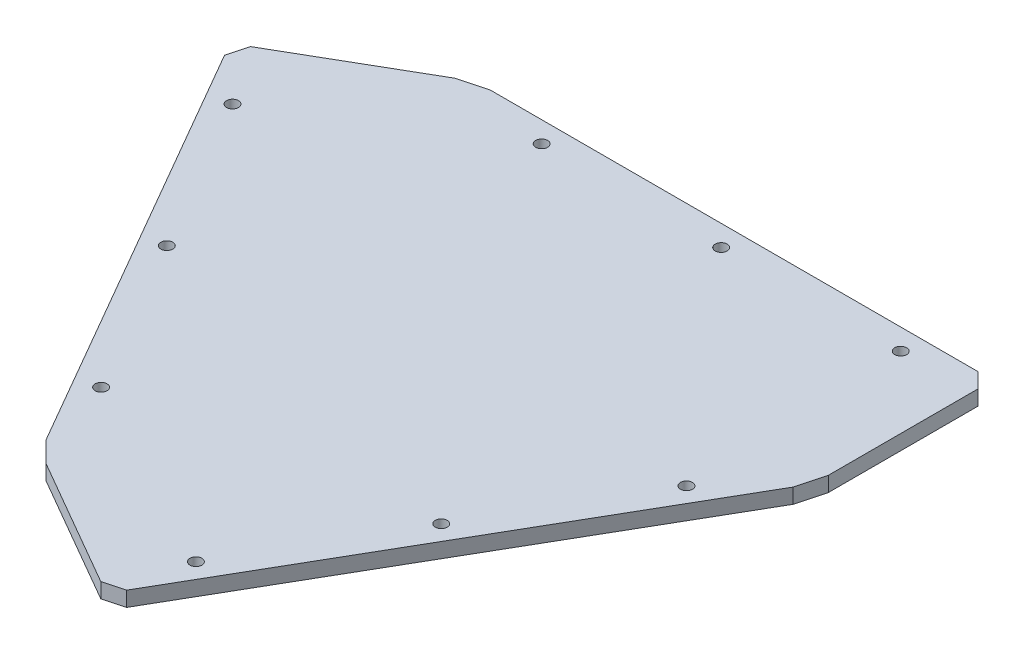
ISO-10303-21;
HEADER;
FILE_DESCRIPTION(('STEP AP214'),'2;1');
FILE_NAME('part.step','',(''),(''),'','','');
FILE_SCHEMA(('AUTOMOTIVE_DESIGN { 1 0 10303 214 1 1 1 1 }'));
ENDSEC;
DATA;
#1=APPLICATION_CONTEXT('core data for automotive mechanical design processes');
#2=APPLICATION_PROTOCOL_DEFINITION('international standard','automotive_design',2000,#1);
#3=PRODUCT_CONTEXT('',#1,'mechanical');
#4=PRODUCT('Part','Part','',(#3));
#5=PRODUCT_RELATED_PRODUCT_CATEGORY('part','',(#4));
#6=PRODUCT_DEFINITION_FORMATION('','',#4);
#7=PRODUCT_DEFINITION_CONTEXT('part definition',#1,'design');
#8=PRODUCT_DEFINITION('design','',#6,#7);
#9=PRODUCT_DEFINITION_SHAPE('','',#8);
#10=(LENGTH_UNIT() NAMED_UNIT(*) SI_UNIT(.MILLI.,.METRE.));
#11=(NAMED_UNIT(*) PLANE_ANGLE_UNIT() SI_UNIT($,.RADIAN.));
#12=(NAMED_UNIT(*) SI_UNIT($,.STERADIAN.) SOLID_ANGLE_UNIT());
#13=UNCERTAINTY_MEASURE_WITH_UNIT(LENGTH_MEASURE(1.E-05),#10,'distance_accuracy_value','');
#14=(GEOMETRIC_REPRESENTATION_CONTEXT(3) GLOBAL_UNCERTAINTY_ASSIGNED_CONTEXT((#13)) GLOBAL_UNIT_ASSIGNED_CONTEXT((#10,
#11,#12)) REPRESENTATION_CONTEXT('',''));
#15=CARTESIAN_POINT('',(0.,0.,0.));
#16=DIRECTION('',(0.,0.,1.));
#17=DIRECTION('',(1.,0.,0.));
#18=AXIS2_PLACEMENT_3D('',#15,#16,#17);
#19=CARTESIAN_POINT('',(12.9903810567668,5.,127.381596569806));
#20=DIRECTION('',(-0.258819045102563,0.,-0.965925826289057));
#21=DIRECTION('',(-0.965925826289057,0.,0.258819045102563));
#22=AXIS2_PLACEMENT_3D('',#19,#20,#21);
#23=PLANE('',#22);
#24=DIRECTION('',(0.965925826289057,0.,-0.258819045102563));
#25=VECTOR('',#24,1.);
#26=CARTESIAN_POINT('',(12.9903810567668,0.,127.381596569806));
#27=LINE('',#26,#25);
#28=CARTESIAN_POINT('',(12.9903810567668,0.,127.381596569806));
#29=VERTEX_POINT('',#28);
#30=CARTESIAN_POINT('',(19.8205080756892,0.,125.551469550883));
#31=VERTEX_POINT('',#30);
#32=EDGE_CURVE('E155',#29,#31,#27,.T.);
#33=ORIENTED_EDGE('',*,*,#32,.T.);
#34=DIRECTION('',(0.,-1.,0.));
#35=VECTOR('',#34,1.);
#36=CARTESIAN_POINT('',(19.8205080756892,5.,125.551469550883));
#37=LINE('',#36,#35);
#38=CARTESIAN_POINT('',(19.8205080756892,5.,125.551469550883));
#39=VERTEX_POINT('',#38);
#40=EDGE_CURVE('E11',#39,#31,#37,.T.);
#41=ORIENTED_EDGE('',*,*,#40,.F.);
#42=DIRECTION('',(0.965925826289057,0.,-0.258819045102563));
#43=VECTOR('',#42,1.);
#44=CARTESIAN_POINT('',(12.9903810567668,5.,127.381596569806));
#45=LINE('',#44,#43);
#46=CARTESIAN_POINT('',(12.9903810567668,5.,127.381596569806));
#47=VERTEX_POINT('',#46);
#48=EDGE_CURVE('E178',#47,#39,#45,.T.);
#49=ORIENTED_EDGE('',*,*,#48,.F.);
#50=DIRECTION('',(0.,-1.,0.));
#51=VECTOR('',#50,1.);
#52=CARTESIAN_POINT('',(12.9903810567668,5.,127.381596569806));
#53=LINE('',#52,#51);
#54=EDGE_CURVE('E151',#47,#29,#53,.T.);
#55=ORIENTED_EDGE('',*,*,#54,.T.);
#56=EDGE_LOOP('',(#33,#41,#49,#55));
#57=FACE_BOUND('',#56,.T.);
#58=ADVANCED_FACE('F35',(#57),#23,.F.);
#59=CARTESIAN_POINT('',(19.8205080756892,5.,125.551469550883));
#60=DIRECTION('',(-0.866025403784438,0.,-0.500000000000001));
#61=DIRECTION('',(-0.500000000000001,0.,0.866025403784438));
#62=AXIS2_PLACEMENT_3D('',#59,#60,#61);
#63=PLANE('',#62);
#64=DIRECTION('',(0.500000000000001,0.,-0.866025403784438));
#65=VECTOR('',#64,1.);
#66=CARTESIAN_POINT('',(19.8205080756892,0.,125.551469550883));
#67=LINE('',#66,#65);
#68=CARTESIAN_POINT('',(101.320508075689,0.,-15.6106712659798));
#69=VERTEX_POINT('',#68);
#70=EDGE_CURVE('E158',#31,#69,#67,.T.);
#71=ORIENTED_EDGE('',*,*,#70,.T.);
#72=DIRECTION('',(0.,-1.,0.));
#73=VECTOR('',#72,1.);
#74=CARTESIAN_POINT('',(101.320508075689,5.,-15.6106712659798));
#75=LINE('',#74,#73);
#76=CARTESIAN_POINT('',(101.320508075689,5.,-15.6106712659798));
#77=VERTEX_POINT('',#76);
#78=EDGE_CURVE('E43',#77,#69,#75,.T.);
#79=ORIENTED_EDGE('',*,*,#78,.F.);
#80=DIRECTION('',(0.500000000000001,0.,-0.866025403784438));
#81=VECTOR('',#80,1.);
#82=CARTESIAN_POINT('',(19.8205080756892,5.,125.551469550883));
#83=LINE('',#82,#81);
#84=EDGE_CURVE('E106',#39,#77,#83,.T.);
#85=ORIENTED_EDGE('',*,*,#84,.F.);
#86=ORIENTED_EDGE('',*,*,#40,.T.);
#87=EDGE_LOOP('',(#71,#79,#85,#86));
#88=FACE_BOUND('',#87,.T.);
#89=ADVANCED_FACE('F257',(#88),#63,.F.);
#90=CARTESIAN_POINT('',(103.820508075689,5.,-24.940798284902));
#91=DIRECTION('',(-0.965925826289067,0.,-0.258819045102527));
#92=DIRECTION('',(-0.258819045102527,0.,0.965925826289067));
#93=AXIS2_PLACEMENT_3D('',#90,#91,#92);
#94=PLANE('',#93);
#95=DIRECTION('',(0.258819045102527,0.,-0.965925826289067));
#96=VECTOR('',#95,1.);
#97=CARTESIAN_POINT('',(103.820508075689,0.,-24.940798284902));
#98=LINE('',#97,#96);
#99=CARTESIAN_POINT('',(103.820508075689,0.,-24.940798284902));
#100=VERTEX_POINT('',#99);
#101=EDGE_CURVE('E161',#69,#100,#98,.T.);
#102=ORIENTED_EDGE('',*,*,#101,.T.);
#103=DIRECTION('',(0.,-1.,0.));
#104=VECTOR('',#103,1.);
#105=CARTESIAN_POINT('',(103.820508075689,5.,-24.940798284902));
#106=LINE('',#105,#104);
#107=CARTESIAN_POINT('',(103.820508075689,5.,-24.940798284902));
#108=VERTEX_POINT('',#107);
#109=EDGE_CURVE('E197',#108,#100,#106,.T.);
#110=ORIENTED_EDGE('',*,*,#109,.F.);
#111=DIRECTION('',(0.258819045102527,0.,-0.965925826289067));
#112=VECTOR('',#111,1.);
#113=CARTESIAN_POINT('',(103.820508075689,5.,-24.940798284902));
#114=LINE('',#113,#112);
#115=EDGE_CURVE('E205',#77,#108,#114,.T.);
#116=ORIENTED_EDGE('',*,*,#115,.F.);
#117=ORIENTED_EDGE('',*,*,#78,.T.);
#118=EDGE_LOOP('',(#102,#110,#116,#117));
#119=FACE_BOUND('',#118,.T.);
#120=ADVANCED_FACE('F203',(#119),#94,.F.);
#121=CARTESIAN_POINT('',(103.820508075689,5.,-74.9407982849015));
#122=DIRECTION('',(-1.,0.,0.));
#123=DIRECTION('',(0.,0.,1.));
#124=AXIS2_PLACEMENT_3D('',#121,#122,#123);
#125=PLANE('',#124);
#126=DIRECTION('',(0.,0.,-1.));
#127=VECTOR('',#126,1.);
#128=CARTESIAN_POINT('',(103.820508075689,0.,-74.9407982849015));
#129=LINE('',#128,#127);
#130=CARTESIAN_POINT('',(103.820508075689,0.,-74.9407982849015));
#131=VERTEX_POINT('',#130);
#132=EDGE_CURVE('E163',#100,#131,#129,.T.);
#133=ORIENTED_EDGE('',*,*,#132,.T.);
#134=DIRECTION('',(0.,-1.,0.));
#135=VECTOR('',#134,1.);
#136=CARTESIAN_POINT('',(103.820508075689,5.,-74.9407982849015));
#137=LINE('',#136,#135);
#138=CARTESIAN_POINT('',(103.820508075689,5.,-74.9407982849015));
#139=VERTEX_POINT('',#138);
#140=EDGE_CURVE('E194',#139,#131,#137,.T.);
#141=ORIENTED_EDGE('',*,*,#140,.F.);
#142=DIRECTION('',(0.,0.,-1.));
#143=VECTOR('',#142,1.);
#144=CARTESIAN_POINT('',(103.820508075689,5.,-74.9407982849015));
#145=LINE('',#144,#143);
#146=EDGE_CURVE('E223',#108,#139,#145,.T.);
#147=ORIENTED_EDGE('',*,*,#146,.F.);
#148=ORIENTED_EDGE('',*,*,#109,.T.);
#149=EDGE_LOOP('',(#133,#141,#147,#148));
#150=FACE_BOUND('',#149,.T.);
#151=ADVANCED_FACE('F214',(#150),#125,.F.);
#152=CARTESIAN_POINT('',(103.820508075689,5.,-74.9407982849015));
#153=DIRECTION('',(-0.70710678118656,0.,0.707106781186535));
#154=DIRECTION('',(0.707106781186535,0.,0.70710678118656));
#155=AXIS2_PLACEMENT_3D('',#152,#153,#154);
#156=PLANE('',#155);
#157=DIRECTION('',(-0.707106781186535,0.,-0.70710678118656));
#158=VECTOR('',#157,1.);
#159=CARTESIAN_POINT('',(103.820508075689,0.,-74.9407982849015));
#160=LINE('',#159,#158);
#161=CARTESIAN_POINT('',(98.8205080756893,0.,-79.9407982849019));
#162=VERTEX_POINT('',#161);
#163=EDGE_CURVE('E165',#131,#162,#160,.T.);
#164=ORIENTED_EDGE('',*,*,#163,.T.);
#165=DIRECTION('',(0.,-1.,0.));
#166=VECTOR('',#165,1.);
#167=CARTESIAN_POINT('',(98.8205080756893,5.,-79.9407982849019));
#168=LINE('',#167,#166);
#169=CARTESIAN_POINT('',(98.8205080756893,5.,-79.9407982849019));
#170=VERTEX_POINT('',#169);
#171=EDGE_CURVE('E191',#170,#162,#168,.T.);
#172=ORIENTED_EDGE('',*,*,#171,.F.);
#173=DIRECTION('',(-0.707106781186535,0.,-0.70710678118656));
#174=VECTOR('',#173,1.);
#175=CARTESIAN_POINT('',(103.820508075689,5.,-74.9407982849015));
#176=LINE('',#175,#174);
#177=EDGE_CURVE('E220',#139,#170,#176,.T.);
#178=ORIENTED_EDGE('',*,*,#177,.F.);
#179=ORIENTED_EDGE('',*,*,#140,.T.);
#180=EDGE_LOOP('',(#164,#172,#178,#179));
#181=FACE_BOUND('',#180,.T.);
#182=ADVANCED_FACE('F218',(#181),#156,.F.);
#183=CARTESIAN_POINT('',(-64.1794919243112,5.,-79.940798284903));
#184=DIRECTION('',(0.,0.,1.));
#185=DIRECTION('',(1.,0.,0.));
#186=AXIS2_PLACEMENT_3D('',#183,#184,#185);
#187=PLANE('',#186);
#188=DIRECTION('',(-1.,0.,0.));
#189=VECTOR('',#188,1.);
#190=CARTESIAN_POINT('',(-64.1794919243112,0.,-79.940798284903));
#191=LINE('',#190,#189);
#192=CARTESIAN_POINT('',(-64.1794919243112,0.,-79.940798284903));
#193=VERTEX_POINT('',#192);
#194=EDGE_CURVE('E167',#162,#193,#191,.T.);
#195=ORIENTED_EDGE('',*,*,#194,.T.);
#196=DIRECTION('',(0.,-1.,0.));
#197=VECTOR('',#196,1.);
#198=CARTESIAN_POINT('',(-64.1794919243112,5.,-79.940798284903));
#199=LINE('',#198,#197);
#200=CARTESIAN_POINT('',(-64.1794919243112,5.,-79.940798284903));
#201=VERTEX_POINT('',#200);
#202=EDGE_CURVE('E188',#201,#193,#199,.T.);
#203=ORIENTED_EDGE('',*,*,#202,.F.);
#204=DIRECTION('',(-1.,0.,0.));
#205=VECTOR('',#204,1.);
#206=CARTESIAN_POINT('',(-64.1794919243112,5.,-79.940798284903));
#207=LINE('',#206,#205);
#208=EDGE_CURVE('E222',#170,#201,#207,.T.);
#209=ORIENTED_EDGE('',*,*,#208,.F.);
#210=ORIENTED_EDGE('',*,*,#171,.T.);
#211=EDGE_LOOP('',(#195,#203,#209,#210));
#212=FACE_BOUND('',#211,.T.);
#213=ADVANCED_FACE('F270',(#212),#187,.F.);
#214=CARTESIAN_POINT('',(-73.5096189432334,5.,-77.440798284903));
#215=DIRECTION('',(0.258819045102516,0.,0.96592582628907));
#216=DIRECTION('',(0.96592582628907,0.,-0.258819045102516));
#217=AXIS2_PLACEMENT_3D('',#214,#215,#216);
#218=PLANE('',#217);
#219=DIRECTION('',(-0.96592582628907,0.,0.258819045102516));
#220=VECTOR('',#219,1.);
#221=CARTESIAN_POINT('',(-73.5096189432334,0.,-77.440798284903));
#222=LINE('',#221,#220);
#223=CARTESIAN_POINT('',(-73.5096189432334,0.,-77.440798284903));
#224=VERTEX_POINT('',#223);
#225=EDGE_CURVE('E169',#193,#224,#222,.T.);
#226=ORIENTED_EDGE('',*,*,#225,.T.);
#227=DIRECTION('',(0.,-1.,0.));
#228=VECTOR('',#227,1.);
#229=CARTESIAN_POINT('',(-73.5096189432334,5.,-77.440798284903));
#230=LINE('',#229,#228);
#231=CARTESIAN_POINT('',(-73.5096189432334,5.,-77.440798284903));
#232=VERTEX_POINT('',#231);
#233=EDGE_CURVE('E185',#232,#224,#230,.T.);
#234=ORIENTED_EDGE('',*,*,#233,.F.);
#235=DIRECTION('',(-0.96592582628907,0.,0.258819045102516));
#236=VECTOR('',#235,1.);
#237=CARTESIAN_POINT('',(-73.5096189432334,5.,-77.440798284903));
#238=LINE('',#237,#236);
#239=EDGE_CURVE('E225',#201,#232,#238,.T.);
#240=ORIENTED_EDGE('',*,*,#239,.F.);
#241=ORIENTED_EDGE('',*,*,#202,.T.);
#242=EDGE_LOOP('',(#226,#234,#240,#241));
#243=FACE_BOUND('',#242,.T.);
#244=ADVANCED_FACE('F273',(#243),#218,.F.);
#245=CARTESIAN_POINT('',(-73.5096189432334,5.,-77.440798284903));
#246=DIRECTION('',(0.499999999999999,0.,0.866025403784439));
#247=DIRECTION('',(0.866025403784439,0.,-0.499999999999999));
#248=AXIS2_PLACEMENT_3D('',#245,#246,#247);
#249=PLANE('',#248);
#250=DIRECTION('',(-0.866025403784439,0.,0.499999999999999));
#251=VECTOR('',#250,1.);
#252=CARTESIAN_POINT('',(-73.5096189432334,0.,-77.440798284903));
#253=LINE('',#252,#251);
#254=CARTESIAN_POINT('',(-116.810889132455,0.,-52.4407982849032));
#255=VERTEX_POINT('',#254);
#256=EDGE_CURVE('E171',#224,#255,#253,.T.);
#257=ORIENTED_EDGE('',*,*,#256,.T.);
#258=DIRECTION('',(0.,-1.,0.));
#259=VECTOR('',#258,1.);
#260=CARTESIAN_POINT('',(-116.810889132455,5.,-52.4407982849032));
#261=LINE('',#260,#259);
#262=CARTESIAN_POINT('',(-116.810889132455,5.,-52.4407982849032));
#263=VERTEX_POINT('',#262);
#264=EDGE_CURVE('E182',#263,#255,#261,.T.);
#265=ORIENTED_EDGE('',*,*,#264,.F.);
#266=DIRECTION('',(-0.866025403784439,0.,0.499999999999999));
#267=VECTOR('',#266,1.);
#268=CARTESIAN_POINT('',(-73.5096189432334,5.,-77.440798284903));
#269=LINE('',#268,#267);
#270=EDGE_CURVE('E231',#232,#263,#269,.T.);
#271=ORIENTED_EDGE('',*,*,#270,.F.);
#272=ORIENTED_EDGE('',*,*,#233,.T.);
#273=EDGE_LOOP('',(#257,#265,#271,#272));
#274=FACE_BOUND('',#273,.T.);
#275=ADVANCED_FACE('F237',(#274),#249,.F.);
#276=CARTESIAN_POINT('',(-116.810889132455,5.,-52.4407982849032));
#277=DIRECTION('',(0.965925826289074,0.,0.258819045102499));
#278=DIRECTION('',(0.258819045102499,0.,-0.965925826289074));
#279=AXIS2_PLACEMENT_3D('',#276,#277,#278);
#280=PLANE('',#279);
#281=DIRECTION('',(-0.258819045102499,0.,0.965925826289074));
#282=VECTOR('',#281,1.);
#283=CARTESIAN_POINT('',(-116.810889132455,0.,-52.4407982849032));
#284=LINE('',#283,#282);
#285=CARTESIAN_POINT('',(-118.641016151377,0.,-45.6106712659807));
#286=VERTEX_POINT('',#285);
#287=EDGE_CURVE('E173',#255,#286,#284,.T.);
#288=ORIENTED_EDGE('',*,*,#287,.T.);
#289=DIRECTION('',(0.,-1.,0.));
#290=VECTOR('',#289,1.);
#291=CARTESIAN_POINT('',(-118.641016151377,5.,-45.6106712659807));
#292=LINE('',#291,#290);
#293=CARTESIAN_POINT('',(-118.641016151377,5.,-45.6106712659807));
#294=VERTEX_POINT('',#293);
#295=EDGE_CURVE('E146',#294,#286,#292,.T.);
#296=ORIENTED_EDGE('',*,*,#295,.F.);
#297=DIRECTION('',(-0.258819045102499,0.,0.965925826289074));
#298=VECTOR('',#297,1.);
#299=CARTESIAN_POINT('',(-116.810889132455,5.,-52.4407982849032));
#300=LINE('',#299,#298);
#301=EDGE_CURVE('E137',#263,#294,#300,.T.);
#302=ORIENTED_EDGE('',*,*,#301,.F.);
#303=ORIENTED_EDGE('',*,*,#264,.T.);
#304=EDGE_LOOP('',(#288,#296,#302,#303));
#305=FACE_BOUND('',#304,.T.);
#306=ADVANCED_FACE('F241',(#305),#280,.F.);
#307=CARTESIAN_POINT('',(-118.641016151377,5.,-45.6106712659807));
#308=DIRECTION('',(0.86602540378444,0.,-0.499999999999998));
#309=DIRECTION('',(-0.499999999999998,0.,-0.86602540378444));
#310=AXIS2_PLACEMENT_3D('',#307,#308,#309);
#311=PLANE('',#310);
#312=DIRECTION('',(0.499999999999998,0.,0.86602540378444));
#313=VECTOR('',#312,1.);
#314=CARTESIAN_POINT('',(-118.641016151377,0.,-45.6106712659807));
#315=LINE('',#314,#313);
#316=CARTESIAN_POINT('',(-37.1410161513774,0.,95.5514695508834));
#317=VERTEX_POINT('',#316);
#318=EDGE_CURVE('E145',#286,#317,#315,.T.);
#319=ORIENTED_EDGE('',*,*,#318,.T.);
#320=DIRECTION('',(0.,-1.,0.));
#321=VECTOR('',#320,1.);
#322=CARTESIAN_POINT('',(-37.1410161513774,5.,95.5514695508834));
#323=LINE('',#322,#321);
#324=CARTESIAN_POINT('',(-37.1410161513774,5.,95.5514695508834));
#325=VERTEX_POINT('',#324);
#326=EDGE_CURVE('E142',#325,#317,#323,.T.);
#327=ORIENTED_EDGE('',*,*,#326,.F.);
#328=DIRECTION('',(0.499999999999998,0.,0.86602540378444));
#329=VECTOR('',#328,1.);
#330=CARTESIAN_POINT('',(-118.641016151377,5.,-45.6106712659807));
#331=LINE('',#330,#329);
#332=EDGE_CURVE('E131',#294,#325,#331,.T.);
#333=ORIENTED_EDGE('',*,*,#332,.F.);
#334=ORIENTED_EDGE('',*,*,#295,.T.);
#335=EDGE_LOOP('',(#319,#327,#333,#334));
#336=FACE_BOUND('',#335,.T.);
#337=ADVANCED_FACE('F143',(#336),#311,.F.);
#338=CARTESIAN_POINT('',(-30.3108891324552,5.,102.381596569806));
#339=DIRECTION('',(0.707106781186546,0.,-0.707106781186549));
#340=DIRECTION('',(-0.707106781186549,0.,-0.707106781186546));
#341=AXIS2_PLACEMENT_3D('',#338,#339,#340);
#342=PLANE('',#341);
#343=DIRECTION('',(0.707106781186549,0.,0.707106781186546));
#344=VECTOR('',#343,1.);
#345=CARTESIAN_POINT('',(-30.3108891324552,0.,102.381596569806));
#346=LINE('',#345,#344);
#347=CARTESIAN_POINT('',(-30.3108891324552,0.,102.381596569806));
#348=VERTEX_POINT('',#347);
#349=EDGE_CURVE('E92',#317,#348,#346,.T.);
#350=ORIENTED_EDGE('',*,*,#349,.T.);
#351=DIRECTION('',(0.,-1.,0.));
#352=VECTOR('',#351,1.);
#353=CARTESIAN_POINT('',(-30.3108891324552,5.,102.381596569806));
#354=LINE('',#353,#352);
#355=CARTESIAN_POINT('',(-30.3108891324552,5.,102.381596569806));
#356=VERTEX_POINT('',#355);
#357=EDGE_CURVE('E147',#356,#348,#354,.T.);
#358=ORIENTED_EDGE('',*,*,#357,.F.);
#359=DIRECTION('',(0.707106781186549,0.,0.707106781186546));
#360=VECTOR('',#359,1.);
#361=CARTESIAN_POINT('',(-30.3108891324552,5.,102.381596569806));
#362=LINE('',#361,#360);
#363=EDGE_CURVE('E135',#325,#356,#362,.T.);
#364=ORIENTED_EDGE('',*,*,#363,.F.);
#365=ORIENTED_EDGE('',*,*,#326,.T.);
#366=EDGE_LOOP('',(#350,#358,#364,#365));
#367=FACE_BOUND('',#366,.T.);
#368=ADVANCED_FACE('F149',(#367),#342,.F.);
#369=CARTESIAN_POINT('',(12.9903810567668,5.,127.381596569806));
#370=DIRECTION('',(0.500000000000001,0.,-0.866025403784438));
#371=DIRECTION('',(-0.866025403784438,0.,-0.500000000000001));
#372=AXIS2_PLACEMENT_3D('',#369,#370,#371);
#373=PLANE('',#372);
#374=DIRECTION('',(0.866025403784438,0.,0.500000000000001));
#375=VECTOR('',#374,1.);
#376=CARTESIAN_POINT('',(12.9903810567668,0.,127.381596569806));
#377=LINE('',#376,#375);
#378=EDGE_CURVE('E98',#348,#29,#377,.T.);
#379=ORIENTED_EDGE('',*,*,#378,.T.);
#380=ORIENTED_EDGE('',*,*,#54,.F.);
#381=DIRECTION('',(0.866025403784438,0.,0.500000000000001));
#382=VECTOR('',#381,1.);
#383=CARTESIAN_POINT('',(12.9903810567668,5.,127.381596569806));
#384=LINE('',#383,#382);
#385=EDGE_CURVE('E51',#356,#47,#384,.T.);
#386=ORIENTED_EDGE('',*,*,#385,.F.);
#387=ORIENTED_EDGE('',*,*,#357,.T.);
#388=EDGE_LOOP('',(#379,#380,#386,#387));
#389=FACE_BOUND('',#388,.T.);
#390=ADVANCED_FACE('F245',(#389),#373,.F.);
#391=CARTESIAN_POINT('',(103.820508075688,5.,103.043737386665));
#392=DIRECTION('',(0.,-1.,0.));
#393=DIRECTION('',(0.,0.,-1.));
#394=AXIS2_PLACEMENT_3D('',#391,#392,#393);
#395=PLANE('',#394);
#396=CARTESIAN_POINT('',(83.1685842870418,5.,1.82938299107432));
#397=DIRECTION('',(0.,1.,0.));
#398=DIRECTION('',(0.,0.,1.));
#399=AXIS2_PLACEMENT_3D('',#396,#397,#398);
#400=CIRCLE('',#399,2.00000000000001);
#401=CARTESIAN_POINT('',(83.1685842870418,5.,3.82938299107432));
#402=VERTEX_POINT('',#401);
#403=EDGE_CURVE('E409',#402,#402,#400,.T.);
#404=ORIENTED_EDGE('',*,*,#403,.F.);
#405=EDGE_LOOP('',(#404));
#406=FACE_BOUND('',#405,.T.);
#407=CARTESIAN_POINT('',(53.1685842870413,5.,53.7909072181404));
#408=DIRECTION('',(0.,1.,0.));
#409=DIRECTION('',(0.,0.,1.));
#410=AXIS2_PLACEMENT_3D('',#407,#408,#409);
#411=CIRCLE('',#410,2.);
#412=CARTESIAN_POINT('',(53.1685842870413,5.,55.7909072181404));
#413=VERTEX_POINT('',#412);
#414=EDGE_CURVE('E413',#413,#413,#411,.T.);
#415=ORIENTED_EDGE('',*,*,#414,.F.);
#416=EDGE_LOOP('',(#415));
#417=FACE_BOUND('',#416,.T.);
#418=CARTESIAN_POINT('',(23.1685842870409,5.,105.752431445206));
#419=DIRECTION('',(0.,1.,0.));
#420=DIRECTION('',(0.,0.,1.));
#421=AXIS2_PLACEMENT_3D('',#418,#419,#420);
#422=CIRCLE('',#421,1.99999999999999);
#423=CARTESIAN_POINT('',(23.1685842870409,5.,107.752431445206));
#424=VERTEX_POINT('',#423);
#425=EDGE_CURVE('E420',#424,#424,#422,.T.);
#426=ORIENTED_EDGE('',*,*,#425,.F.);
#427=EDGE_LOOP('',(#426));
#428=FACE_BOUND('',#427,.T.);
#429=CARTESIAN_POINT('',(-39.9999999999997,5.,-72.9407982849025));
#430=DIRECTION('',(0.,1.,0.));
#431=DIRECTION('',(0.,0.,1.));
#432=AXIS2_PLACEMENT_3D('',#429,#430,#431);
#433=CIRCLE('',#432,2.);
#434=CARTESIAN_POINT('',(-39.9999999999997,5.,-70.9407982849025));
#435=VERTEX_POINT('',#434);
#436=EDGE_CURVE('E426',#435,#435,#433,.T.);
#437=ORIENTED_EDGE('',*,*,#436,.F.);
#438=EDGE_LOOP('',(#437));
#439=FACE_BOUND('',#438,.T.);
#440=CARTESIAN_POINT('',(20.0000000000003,5.,-72.9407982849022));
#441=DIRECTION('',(0.,1.,0.));
#442=DIRECTION('',(0.,0.,1.));
#443=AXIS2_PLACEMENT_3D('',#440,#441,#442);
#444=CIRCLE('',#443,2.);
#445=CARTESIAN_POINT('',(20.0000000000003,5.,-70.9407982849022));
#446=VERTEX_POINT('',#445);
#447=EDGE_CURVE('E432',#446,#446,#444,.T.);
#448=ORIENTED_EDGE('',*,*,#447,.F.);
#449=EDGE_LOOP('',(#448));
#450=FACE_BOUND('',#449,.T.);
#451=CARTESIAN_POINT('',(80.0000000000003,5.,-72.940798284902));
#452=DIRECTION('',(0.,1.,0.));
#453=DIRECTION('',(0.,0.,1.));
#454=AXIS2_PLACEMENT_3D('',#451,#452,#453);
#455=CIRCLE('',#454,2.);
#456=CARTESIAN_POINT('',(80.0000000000003,5.,-70.940798284902));
#457=VERTEX_POINT('',#456);
#458=EDGE_CURVE('E438',#457,#457,#455,.T.);
#459=ORIENTED_EDGE('',*,*,#458,.F.);
#460=EDGE_LOOP('',(#459));
#461=FACE_BOUND('',#460,.T.);
#462=CARTESIAN_POINT('',(-43.1685842870418,5.,71.1114152938288));
#463=DIRECTION('',(0.,1.,0.));
#464=DIRECTION('',(0.,0.,1.));
#465=AXIS2_PLACEMENT_3D('',#462,#463,#464);
#466=CIRCLE('',#465,2.);
#467=CARTESIAN_POINT('',(-43.1685842870418,5.,73.1114152938288));
#468=VERTEX_POINT('',#467);
#469=EDGE_CURVE('E444',#468,#468,#466,.T.);
#470=ORIENTED_EDGE('',*,*,#469,.F.);
#471=EDGE_LOOP('',(#470));
#472=FACE_BOUND('',#471,.T.);
#473=CARTESIAN_POINT('',(-73.1685842870418,5.,19.1498910667624));
#474=DIRECTION('',(0.,1.,0.));
#475=DIRECTION('',(0.,0.,1.));
#476=AXIS2_PLACEMENT_3D('',#473,#474,#475);
#477=CIRCLE('',#476,2.);
#478=CARTESIAN_POINT('',(-73.1685842870418,5.,21.1498910667624));
#479=VERTEX_POINT('',#478);
#480=EDGE_CURVE('E450',#479,#479,#477,.T.);
#481=ORIENTED_EDGE('',*,*,#480,.F.);
#482=EDGE_LOOP('',(#481));
#483=FACE_BOUND('',#482,.T.);
#484=CARTESIAN_POINT('',(-103.168584287042,5.,-32.8116331603039));
#485=DIRECTION('',(0.,1.,0.));
#486=DIRECTION('',(0.,0.,1.));
#487=AXIS2_PLACEMENT_3D('',#484,#485,#486);
#488=CIRCLE('',#487,2.);
#489=CARTESIAN_POINT('',(-103.168584287042,5.,-30.8116331603039));
#490=VERTEX_POINT('',#489);
#491=EDGE_CURVE('E159',#490,#490,#488,.T.);
#492=ORIENTED_EDGE('',*,*,#491,.F.);
#493=EDGE_LOOP('',(#492));
#494=FACE_BOUND('',#493,.T.);
#495=ORIENTED_EDGE('',*,*,#48,.T.);
#496=ORIENTED_EDGE('',*,*,#84,.T.);
#497=ORIENTED_EDGE('',*,*,#115,.T.);
#498=ORIENTED_EDGE('',*,*,#146,.T.);
#499=ORIENTED_EDGE('',*,*,#177,.T.);
#500=ORIENTED_EDGE('',*,*,#208,.T.);
#501=ORIENTED_EDGE('',*,*,#239,.T.);
#502=ORIENTED_EDGE('',*,*,#270,.T.);
#503=ORIENTED_EDGE('',*,*,#301,.T.);
#504=ORIENTED_EDGE('',*,*,#332,.T.);
#505=ORIENTED_EDGE('',*,*,#363,.T.);
#506=ORIENTED_EDGE('',*,*,#385,.T.);
#507=EDGE_LOOP('',(#495,#496,#497,#498,#499,#500,#501,#502,#503,#504,#505,#506));
#508=FACE_BOUND('',#507,.T.);
#509=ADVANCED_FACE('F133',(#406,#417,#428,#439,#450,#461,#472,#483,#494,#508),#395,.F.);
#510=CARTESIAN_POINT('',(103.820508075688,0.,103.043737386665));
#511=DIRECTION('',(0.,-1.,0.));
#512=DIRECTION('',(0.,0.,-1.));
#513=AXIS2_PLACEMENT_3D('',#510,#511,#512);
#514=PLANE('',#513);
#515=CARTESIAN_POINT('',(83.1685842870418,0.,1.82938299107432));
#516=DIRECTION('',(0.,-1.,0.));
#517=DIRECTION('',(0.,0.,-1.));
#518=AXIS2_PLACEMENT_3D('',#515,#516,#517);
#519=CIRCLE('',#518,2.00000000000001);
#520=CARTESIAN_POINT('',(83.1685842870418,0.,-0.170617008925688));
#521=VERTEX_POINT('',#520);
#522=EDGE_CURVE('E406',#521,#521,#519,.F.);
#523=ORIENTED_EDGE('',*,*,#522,.T.);
#524=EDGE_LOOP('',(#523));
#525=FACE_BOUND('',#524,.T.);
#526=CARTESIAN_POINT('',(53.1685842870413,0.,53.7909072181404));
#527=DIRECTION('',(0.,-1.,0.));
#528=DIRECTION('',(0.,0.,-1.));
#529=AXIS2_PLACEMENT_3D('',#526,#527,#528);
#530=CIRCLE('',#529,2.);
#531=CARTESIAN_POINT('',(53.1685842870413,0.,51.7909072181404));
#532=VERTEX_POINT('',#531);
#533=EDGE_CURVE('E410',#532,#532,#530,.F.);
#534=ORIENTED_EDGE('',*,*,#533,.T.);
#535=EDGE_LOOP('',(#534));
#536=FACE_BOUND('',#535,.T.);
#537=CARTESIAN_POINT('',(23.1685842870409,0.,105.752431445206));
#538=DIRECTION('',(0.,-1.,0.));
#539=DIRECTION('',(0.,0.,-1.));
#540=AXIS2_PLACEMENT_3D('',#537,#538,#539);
#541=CIRCLE('',#540,1.99999999999999);
#542=CARTESIAN_POINT('',(23.1685842870409,0.,103.752431445206));
#543=VERTEX_POINT('',#542);
#544=EDGE_CURVE('E418',#543,#543,#541,.F.);
#545=ORIENTED_EDGE('',*,*,#544,.T.);
#546=EDGE_LOOP('',(#545));
#547=FACE_BOUND('',#546,.T.);
#548=CARTESIAN_POINT('',(-39.9999999999997,0.,-72.9407982849025));
#549=DIRECTION('',(0.,-1.,0.));
#550=DIRECTION('',(0.,0.,-1.));
#551=AXIS2_PLACEMENT_3D('',#548,#549,#550);
#552=CIRCLE('',#551,2.);
#553=CARTESIAN_POINT('',(-39.9999999999997,0.,-74.9407982849025));
#554=VERTEX_POINT('',#553);
#555=EDGE_CURVE('E423',#554,#554,#552,.F.);
#556=ORIENTED_EDGE('',*,*,#555,.T.);
#557=EDGE_LOOP('',(#556));
#558=FACE_BOUND('',#557,.T.);
#559=CARTESIAN_POINT('',(20.0000000000003,0.,-72.9407982849022));
#560=DIRECTION('',(0.,-1.,0.));
#561=DIRECTION('',(0.,0.,-1.));
#562=AXIS2_PLACEMENT_3D('',#559,#560,#561);
#563=CIRCLE('',#562,2.);
#564=CARTESIAN_POINT('',(20.0000000000003,0.,-74.9407982849022));
#565=VERTEX_POINT('',#564);
#566=EDGE_CURVE('E429',#565,#565,#563,.F.);
#567=ORIENTED_EDGE('',*,*,#566,.T.);
#568=EDGE_LOOP('',(#567));
#569=FACE_BOUND('',#568,.T.);
#570=CARTESIAN_POINT('',(80.0000000000003,0.,-72.940798284902));
#571=DIRECTION('',(0.,-1.,0.));
#572=DIRECTION('',(0.,0.,-1.));
#573=AXIS2_PLACEMENT_3D('',#570,#571,#572);
#574=CIRCLE('',#573,2.);
#575=CARTESIAN_POINT('',(80.0000000000003,0.,-74.940798284902));
#576=VERTEX_POINT('',#575);
#577=EDGE_CURVE('E435',#576,#576,#574,.F.);
#578=ORIENTED_EDGE('',*,*,#577,.T.);
#579=EDGE_LOOP('',(#578));
#580=FACE_BOUND('',#579,.T.);
#581=CARTESIAN_POINT('',(-43.1685842870418,0.,71.1114152938288));
#582=DIRECTION('',(0.,-1.,0.));
#583=DIRECTION('',(0.,0.,-1.));
#584=AXIS2_PLACEMENT_3D('',#581,#582,#583);
#585=CIRCLE('',#584,2.);
#586=CARTESIAN_POINT('',(-43.1685842870418,0.,69.1114152938287));
#587=VERTEX_POINT('',#586);
#588=EDGE_CURVE('E441',#587,#587,#585,.F.);
#589=ORIENTED_EDGE('',*,*,#588,.T.);
#590=EDGE_LOOP('',(#589));
#591=FACE_BOUND('',#590,.T.);
#592=CARTESIAN_POINT('',(-73.1685842870418,0.,19.1498910667624));
#593=DIRECTION('',(0.,-1.,0.));
#594=DIRECTION('',(0.,0.,-1.));
#595=AXIS2_PLACEMENT_3D('',#592,#593,#594);
#596=CIRCLE('',#595,2.);
#597=CARTESIAN_POINT('',(-73.1685842870418,0.,17.1498910667624));
#598=VERTEX_POINT('',#597);
#599=EDGE_CURVE('E447',#598,#598,#596,.F.);
#600=ORIENTED_EDGE('',*,*,#599,.T.);
#601=EDGE_LOOP('',(#600));
#602=FACE_BOUND('',#601,.T.);
#603=CARTESIAN_POINT('',(-103.168584287042,0.,-32.8116331603039));
#604=DIRECTION('',(0.,-1.,0.));
#605=DIRECTION('',(0.,0.,-1.));
#606=AXIS2_PLACEMENT_3D('',#603,#604,#605);
#607=CIRCLE('',#606,2.);
#608=CARTESIAN_POINT('',(-103.168584287042,0.,-34.8116331603039));
#609=VERTEX_POINT('',#608);
#610=EDGE_CURVE('E453',#609,#609,#607,.F.);
#611=ORIENTED_EDGE('',*,*,#610,.T.);
#612=EDGE_LOOP('',(#611));
#613=FACE_BOUND('',#612,.T.);
#614=ORIENTED_EDGE('',*,*,#32,.F.);
#615=ORIENTED_EDGE('',*,*,#378,.F.);
#616=ORIENTED_EDGE('',*,*,#349,.F.);
#617=ORIENTED_EDGE('',*,*,#318,.F.);
#618=ORIENTED_EDGE('',*,*,#287,.F.);
#619=ORIENTED_EDGE('',*,*,#256,.F.);
#620=ORIENTED_EDGE('',*,*,#225,.F.);
#621=ORIENTED_EDGE('',*,*,#194,.F.);
#622=ORIENTED_EDGE('',*,*,#163,.F.);
#623=ORIENTED_EDGE('',*,*,#132,.F.);
#624=ORIENTED_EDGE('',*,*,#101,.F.);
#625=ORIENTED_EDGE('',*,*,#70,.F.);
#626=EDGE_LOOP('',(#614,#615,#616,#617,#618,#619,#620,#621,#622,#623,#624,#625));
#627=FACE_BOUND('',#626,.T.);
#628=ADVANCED_FACE('F209',(#525,#536,#547,#558,#569,#580,#591,#602,#613,#627),#514,.T.);
#629=CARTESIAN_POINT('',(-103.168584287042,-0.00100000000000013,-32.8116331603039));
#630=DIRECTION('',(0.,1.,0.));
#631=DIRECTION('',(0.,0.,1.));
#632=AXIS2_PLACEMENT_3D('',#629,#630,#631);
#633=CYLINDRICAL_SURFACE('',#632,2.);
#634=ORIENTED_EDGE('',*,*,#610,.F.);
#635=EDGE_LOOP('',(#634));
#636=FACE_BOUND('',#635,.T.);
#637=ORIENTED_EDGE('',*,*,#491,.T.);
#638=EDGE_LOOP('',(#637));
#639=FACE_BOUND('',#638,.T.);
#640=ADVANCED_FACE('F310',(#636,#639),#633,.F.);
#641=CARTESIAN_POINT('',(-73.1685842870418,-0.00100000000000013,19.1498910667624));
#642=DIRECTION('',(0.,1.,0.));
#643=DIRECTION('',(0.,0.,1.));
#644=AXIS2_PLACEMENT_3D('',#641,#642,#643);
#645=CYLINDRICAL_SURFACE('',#644,2.);
#646=ORIENTED_EDGE('',*,*,#599,.F.);
#647=EDGE_LOOP('',(#646));
#648=FACE_BOUND('',#647,.T.);
#649=ORIENTED_EDGE('',*,*,#480,.T.);
#650=EDGE_LOOP('',(#649));
#651=FACE_BOUND('',#650,.T.);
#652=ADVANCED_FACE('F319',(#648,#651),#645,.F.);
#653=CARTESIAN_POINT('',(-43.1685842870418,-0.00100000000000013,71.1114152938288));
#654=DIRECTION('',(0.,1.,0.));
#655=DIRECTION('',(0.,0.,1.));
#656=AXIS2_PLACEMENT_3D('',#653,#654,#655);
#657=CYLINDRICAL_SURFACE('',#656,2.);
#658=ORIENTED_EDGE('',*,*,#588,.F.);
#659=EDGE_LOOP('',(#658));
#660=FACE_BOUND('',#659,.T.);
#661=ORIENTED_EDGE('',*,*,#469,.T.);
#662=EDGE_LOOP('',(#661));
#663=FACE_BOUND('',#662,.T.);
#664=ADVANCED_FACE('F329',(#660,#663),#657,.F.);
#665=CARTESIAN_POINT('',(80.0000000000003,-0.00100000000000013,-72.940798284902));
#666=DIRECTION('',(0.,1.,0.));
#667=DIRECTION('',(0.,0.,1.));
#668=AXIS2_PLACEMENT_3D('',#665,#666,#667);
#669=CYLINDRICAL_SURFACE('',#668,2.);
#670=ORIENTED_EDGE('',*,*,#577,.F.);
#671=EDGE_LOOP('',(#670));
#672=FACE_BOUND('',#671,.T.);
#673=ORIENTED_EDGE('',*,*,#458,.T.);
#674=EDGE_LOOP('',(#673));
#675=FACE_BOUND('',#674,.T.);
#676=ADVANCED_FACE('F339',(#672,#675),#669,.F.);
#677=CARTESIAN_POINT('',(20.0000000000003,-0.00100000000000013,-72.9407982849022));
#678=DIRECTION('',(0.,1.,0.));
#679=DIRECTION('',(0.,0.,1.));
#680=AXIS2_PLACEMENT_3D('',#677,#678,#679);
#681=CYLINDRICAL_SURFACE('',#680,2.);
#682=ORIENTED_EDGE('',*,*,#566,.F.);
#683=EDGE_LOOP('',(#682));
#684=FACE_BOUND('',#683,.T.);
#685=ORIENTED_EDGE('',*,*,#447,.T.);
#686=EDGE_LOOP('',(#685));
#687=FACE_BOUND('',#686,.T.);
#688=ADVANCED_FACE('F349',(#684,#687),#681,.F.);
#689=CARTESIAN_POINT('',(-39.9999999999997,-0.00100000000000013,-72.9407982849025));
#690=DIRECTION('',(0.,1.,0.));
#691=DIRECTION('',(0.,0.,1.));
#692=AXIS2_PLACEMENT_3D('',#689,#690,#691);
#693=CYLINDRICAL_SURFACE('',#692,2.);
#694=ORIENTED_EDGE('',*,*,#555,.F.);
#695=EDGE_LOOP('',(#694));
#696=FACE_BOUND('',#695,.T.);
#697=ORIENTED_EDGE('',*,*,#436,.T.);
#698=EDGE_LOOP('',(#697));
#699=FACE_BOUND('',#698,.T.);
#700=ADVANCED_FACE('F359',(#696,#699),#693,.F.);
#701=CARTESIAN_POINT('',(23.1685842870409,-0.00100000000000013,105.752431445206));
#702=DIRECTION('',(0.,1.,0.));
#703=DIRECTION('',(0.,0.,1.));
#704=AXIS2_PLACEMENT_3D('',#701,#702,#703);
#705=CYLINDRICAL_SURFACE('',#704,1.99999999999999);
#706=ORIENTED_EDGE('',*,*,#544,.F.);
#707=EDGE_LOOP('',(#706));
#708=FACE_BOUND('',#707,.T.);
#709=ORIENTED_EDGE('',*,*,#425,.T.);
#710=EDGE_LOOP('',(#709));
#711=FACE_BOUND('',#710,.T.);
#712=ADVANCED_FACE('F369',(#708,#711),#705,.F.);
#713=CARTESIAN_POINT('',(53.1685842870413,-0.00100000000000013,53.7909072181404));
#714=DIRECTION('',(0.,1.,0.));
#715=DIRECTION('',(0.,0.,1.));
#716=AXIS2_PLACEMENT_3D('',#713,#714,#715);
#717=CYLINDRICAL_SURFACE('',#716,2.);
#718=ORIENTED_EDGE('',*,*,#533,.F.);
#719=EDGE_LOOP('',(#718));
#720=FACE_BOUND('',#719,.T.);
#721=ORIENTED_EDGE('',*,*,#414,.T.);
#722=EDGE_LOOP('',(#721));
#723=FACE_BOUND('',#722,.T.);
#724=ADVANCED_FACE('F379',(#720,#723),#717,.F.);
#725=CARTESIAN_POINT('',(83.1685842870418,-0.00100000000000013,1.82938299107432));
#726=DIRECTION('',(0.,1.,0.));
#727=DIRECTION('',(0.,0.,1.));
#728=AXIS2_PLACEMENT_3D('',#725,#726,#727);
#729=CYLINDRICAL_SURFACE('',#728,2.00000000000001);
#730=ORIENTED_EDGE('',*,*,#522,.F.);
#731=EDGE_LOOP('',(#730));
#732=FACE_BOUND('',#731,.T.);
#733=ORIENTED_EDGE('',*,*,#403,.T.);
#734=EDGE_LOOP('',(#733));
#735=FACE_BOUND('',#734,.T.);
#736=ADVANCED_FACE('F389',(#732,#735),#729,.F.);
#737=CLOSED_SHELL('',(#58,#89,#120,#151,#182,#213,#244,#275,#306,#337,#368,#390,#509,#628,#640,
#652,#664,#676,#688,#700,#712,#724,#736));
#738=MANIFOLD_SOLID_BREP('B2',#737);
#739=ADVANCED_BREP_SHAPE_REPRESENTATION('',(#18,#738),#14);
#740=SHAPE_DEFINITION_REPRESENTATION(#9,#739);
ENDSEC;
END-ISO-10303-21;
